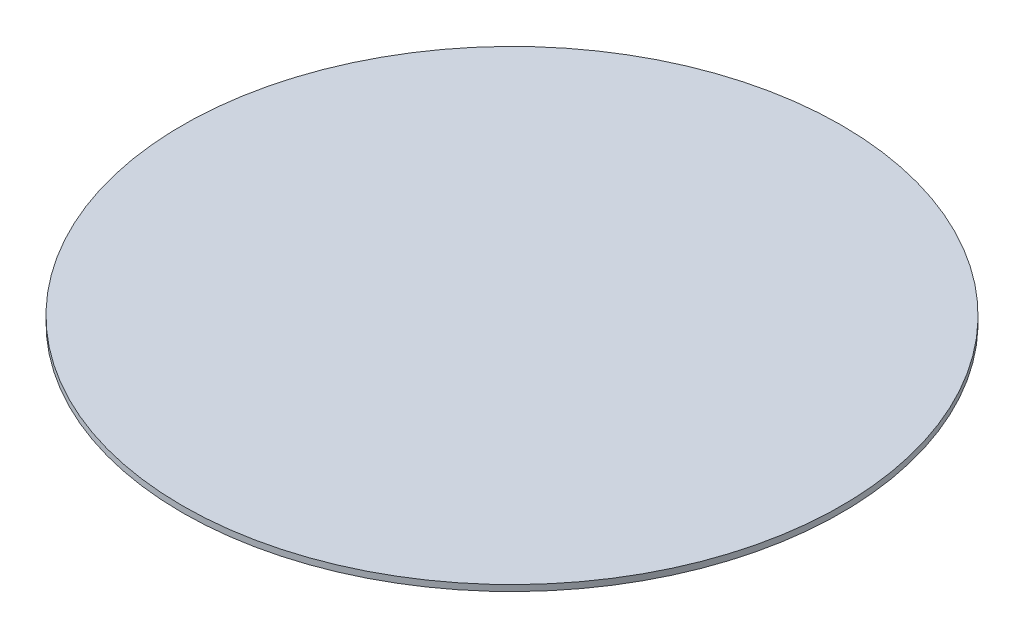
ISO-10303-21;
HEADER;
FILE_DESCRIPTION(('STEP AP214'),'2;1');
FILE_NAME('part.step','',(''),(''),'','','');
FILE_SCHEMA(('AUTOMOTIVE_DESIGN { 1 0 10303 214 1 1 1 1 }'));
ENDSEC;
DATA;
#1=APPLICATION_CONTEXT('core data for automotive mechanical design processes');
#2=APPLICATION_PROTOCOL_DEFINITION('international standard','automotive_design',2000,#1);
#3=PRODUCT_CONTEXT('',#1,'mechanical');
#4=PRODUCT('Part','Part','',(#3));
#5=PRODUCT_RELATED_PRODUCT_CATEGORY('part','',(#4));
#6=PRODUCT_DEFINITION_FORMATION('','',#4);
#7=PRODUCT_DEFINITION_CONTEXT('part definition',#1,'design');
#8=PRODUCT_DEFINITION('design','',#6,#7);
#9=PRODUCT_DEFINITION_SHAPE('','',#8);
#10=(LENGTH_UNIT() NAMED_UNIT(*) SI_UNIT(.MILLI.,.METRE.));
#11=(NAMED_UNIT(*) PLANE_ANGLE_UNIT() SI_UNIT($,.RADIAN.));
#12=(NAMED_UNIT(*) SI_UNIT($,.STERADIAN.) SOLID_ANGLE_UNIT());
#13=UNCERTAINTY_MEASURE_WITH_UNIT(LENGTH_MEASURE(1.E-05),#10,'distance_accuracy_value','');
#14=(GEOMETRIC_REPRESENTATION_CONTEXT(3) GLOBAL_UNCERTAINTY_ASSIGNED_CONTEXT((#13)) GLOBAL_UNIT_ASSIGNED_CONTEXT((#10,
#11,#12)) REPRESENTATION_CONTEXT('',''));
#15=CARTESIAN_POINT('',(0.,0.,0.));
#16=DIRECTION('',(0.,0.,1.));
#17=DIRECTION('',(1.,0.,0.));
#18=AXIS2_PLACEMENT_3D('',#15,#16,#17);
#19=CARTESIAN_POINT('',(0.,-0.7366,0.));
#20=DIRECTION('',(0.,1.,0.));
#21=DIRECTION('',(0.,0.,1.));
#22=AXIS2_PLACEMENT_3D('',#19,#20,#21);
#23=CYLINDRICAL_SURFACE('',#22,40.);
#24=CARTESIAN_POINT('',(0.,-0.7366,0.));
#25=DIRECTION('',(0.,1.,0.));
#26=DIRECTION('',(0.,0.,1.));
#27=AXIS2_PLACEMENT_3D('',#24,#25,#26);
#28=CIRCLE('',#27,40.);
#29=CARTESIAN_POINT('',(0.,-0.7366,40.));
#30=VERTEX_POINT('',#29);
#31=EDGE_CURVE('E10',#30,#30,#28,.T.);
#32=ORIENTED_EDGE('',*,*,#31,.T.);
#33=EDGE_LOOP('',(#32));
#34=FACE_BOUND('',#33,.T.);
#35=CARTESIAN_POINT('',(0.,0.,0.));
#36=DIRECTION('',(0.,1.,0.));
#37=DIRECTION('',(0.,0.,1.));
#38=AXIS2_PLACEMENT_3D('',#35,#36,#37);
#39=CIRCLE('',#38,40.);
#40=CARTESIAN_POINT('',(0.,0.,40.));
#41=VERTEX_POINT('',#40);
#42=EDGE_CURVE('E38',#41,#41,#39,.T.);
#43=ORIENTED_EDGE('',*,*,#42,.F.);
#44=EDGE_LOOP('',(#43));
#45=FACE_BOUND('',#44,.T.);
#46=ADVANCED_FACE('F35',(#34,#45),#23,.T.);
#47=CARTESIAN_POINT('',(0.,-0.7366,0.));
#48=DIRECTION('',(0.,1.,0.));
#49=DIRECTION('',(0.,0.,1.));
#50=AXIS2_PLACEMENT_3D('',#47,#48,#49);
#51=PLANE('',#50);
#52=ORIENTED_EDGE('',*,*,#31,.F.);
#53=EDGE_LOOP('',(#52));
#54=FACE_BOUND('',#53,.T.);
#55=ADVANCED_FACE('F50',(#54),#51,.F.);
#56=CARTESIAN_POINT('',(0.,0.,0.));
#57=DIRECTION('',(0.,1.,0.));
#58=DIRECTION('',(0.,0.,1.));
#59=AXIS2_PLACEMENT_3D('',#56,#57,#58);
#60=PLANE('',#59);
#61=ORIENTED_EDGE('',*,*,#42,.T.);
#62=EDGE_LOOP('',(#61));
#63=FACE_BOUND('',#62,.T.);
#64=ADVANCED_FACE('F47',(#63),#60,.T.);
#65=CLOSED_SHELL('',(#46,#55,#64));
#66=MANIFOLD_SOLID_BREP('B2',#65);
#67=ADVANCED_BREP_SHAPE_REPRESENTATION('',(#18,#66),#14);
#68=SHAPE_DEFINITION_REPRESENTATION(#9,#67);
ENDSEC;
END-ISO-10303-21;
